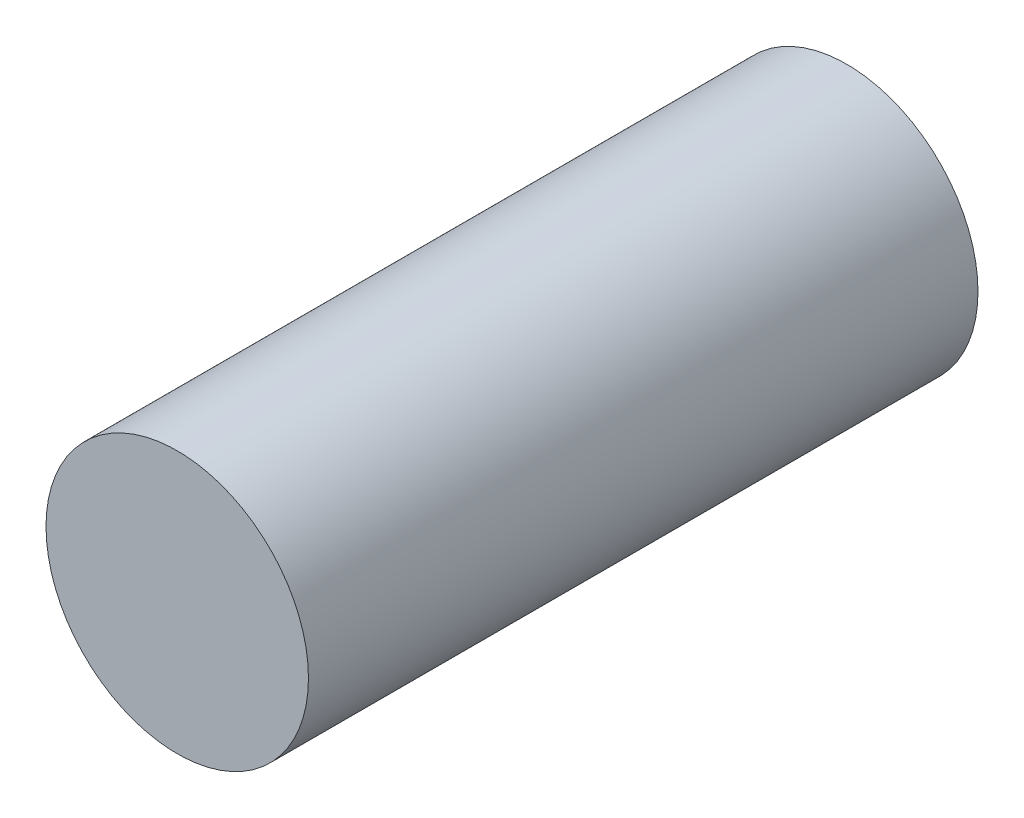
ISO-10303-21;
HEADER;
FILE_DESCRIPTION(('STEP AP214'),'2;1');
FILE_NAME('part.step','',(''),(''),'','','');
FILE_SCHEMA(('AUTOMOTIVE_DESIGN { 1 0 10303 214 1 1 1 1 }'));
ENDSEC;
DATA;
#1=APPLICATION_CONTEXT('core data for automotive mechanical design processes');
#2=APPLICATION_PROTOCOL_DEFINITION('international standard','automotive_design',2000,#1);
#3=PRODUCT_CONTEXT('',#1,'mechanical');
#4=PRODUCT('Part','Part','',(#3));
#5=PRODUCT_RELATED_PRODUCT_CATEGORY('part','',(#4));
#6=PRODUCT_DEFINITION_FORMATION('','',#4);
#7=PRODUCT_DEFINITION_CONTEXT('part definition',#1,'design');
#8=PRODUCT_DEFINITION('design','',#6,#7);
#9=PRODUCT_DEFINITION_SHAPE('','',#8);
#10=(LENGTH_UNIT() NAMED_UNIT(*) SI_UNIT(.MILLI.,.METRE.));
#11=(NAMED_UNIT(*) PLANE_ANGLE_UNIT() SI_UNIT($,.RADIAN.));
#12=(NAMED_UNIT(*) SI_UNIT($,.STERADIAN.) SOLID_ANGLE_UNIT());
#13=UNCERTAINTY_MEASURE_WITH_UNIT(LENGTH_MEASURE(1.E-05),#10,'distance_accuracy_value','');
#14=(GEOMETRIC_REPRESENTATION_CONTEXT(3) GLOBAL_UNCERTAINTY_ASSIGNED_CONTEXT((#13)) GLOBAL_UNIT_ASSIGNED_CONTEXT((#10,
#11,#12)) REPRESENTATION_CONTEXT('',''));
#15=CARTESIAN_POINT('',(0.,0.,0.));
#16=DIRECTION('',(0.,0.,1.));
#17=DIRECTION('',(1.,0.,0.));
#18=AXIS2_PLACEMENT_3D('',#15,#16,#17);
#19=CARTESIAN_POINT('',(0.,0.,6.35));
#20=DIRECTION('',(0.,0.,-1.));
#21=DIRECTION('',(-1.,0.,0.));
#22=AXIS2_PLACEMENT_3D('',#19,#20,#21);
#23=CYLINDRICAL_SURFACE('',#22,1.2446);
#24=CARTESIAN_POINT('',(0.,0.,6.35));
#25=DIRECTION('',(0.,0.,1.));
#26=DIRECTION('',(1.,0.,0.));
#27=AXIS2_PLACEMENT_3D('',#24,#25,#26);
#28=CIRCLE('',#27,1.2446);
#29=CARTESIAN_POINT('',(1.2446,0.,6.35));
#30=VERTEX_POINT('',#29);
#31=EDGE_CURVE('E10',#30,#30,#28,.T.);
#32=ORIENTED_EDGE('',*,*,#31,.F.);
#33=EDGE_LOOP('',(#32));
#34=FACE_BOUND('',#33,.T.);
#35=CARTESIAN_POINT('',(0.,0.,0.));
#36=DIRECTION('',(0.,0.,1.));
#37=DIRECTION('',(1.,0.,0.));
#38=AXIS2_PLACEMENT_3D('',#35,#36,#37);
#39=CIRCLE('',#38,1.2446);
#40=CARTESIAN_POINT('',(1.2446,0.,0.));
#41=VERTEX_POINT('',#40);
#42=EDGE_CURVE('E44',#41,#41,#39,.T.);
#43=ORIENTED_EDGE('',*,*,#42,.T.);
#44=EDGE_LOOP('',(#43));
#45=FACE_BOUND('',#44,.T.);
#46=ADVANCED_FACE('F41',(#34,#45),#23,.T.);
#47=CARTESIAN_POINT('',(0.,0.,6.35));
#48=DIRECTION('',(0.,0.,1.));
#49=DIRECTION('',(1.,0.,0.));
#50=AXIS2_PLACEMENT_3D('',#47,#48,#49);
#51=PLANE('',#50);
#52=ORIENTED_EDGE('',*,*,#31,.T.);
#53=EDGE_LOOP('',(#52));
#54=FACE_BOUND('',#53,.T.);
#55=ADVANCED_FACE('F60',(#54),#51,.T.);
#56=CARTESIAN_POINT('',(0.,0.,0.));
#57=DIRECTION('',(0.,0.,1.));
#58=DIRECTION('',(1.,0.,0.));
#59=AXIS2_PLACEMENT_3D('',#56,#57,#58);
#60=PLANE('',#59);
#61=ORIENTED_EDGE('',*,*,#42,.F.);
#62=EDGE_LOOP('',(#61));
#63=FACE_BOUND('',#62,.T.);
#64=ADVANCED_FACE('F58',(#63),#60,.F.);
#65=CLOSED_SHELL('',(#46,#55,#64));
#66=MANIFOLD_SOLID_BREP('B2',#65);
#67=ADVANCED_BREP_SHAPE_REPRESENTATION('',(#18,#66),#14);
#68=SHAPE_DEFINITION_REPRESENTATION(#9,#67);
ENDSEC;
END-ISO-10303-21;
